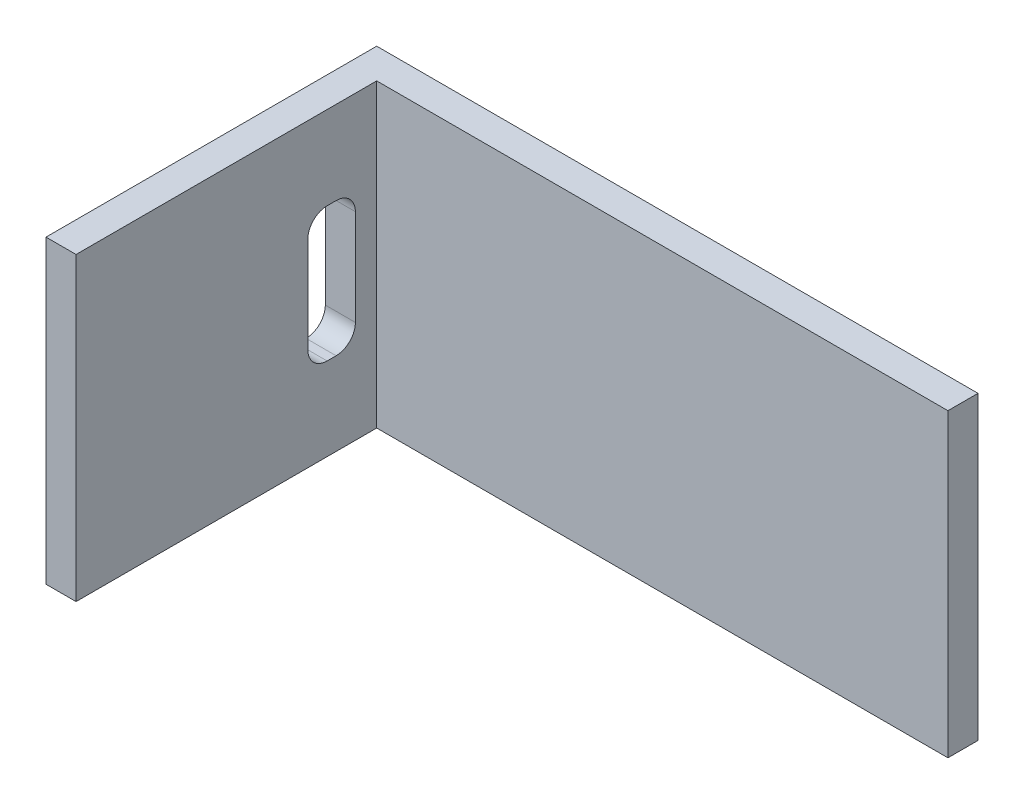
ISO-10303-21;
HEADER;
FILE_DESCRIPTION(('STEP AP214'),'2;1');
FILE_NAME('part.step','',(''),(''),'','','');
FILE_SCHEMA(('AUTOMOTIVE_DESIGN { 1 0 10303 214 1 1 1 1 }'));
ENDSEC;
DATA;
#1=APPLICATION_CONTEXT('core data for automotive mechanical design processes');
#2=APPLICATION_PROTOCOL_DEFINITION('international standard','automotive_design',2000,#1);
#3=PRODUCT_CONTEXT('',#1,'mechanical');
#4=PRODUCT('Part','Part','',(#3));
#5=PRODUCT_RELATED_PRODUCT_CATEGORY('part','',(#4));
#6=PRODUCT_DEFINITION_FORMATION('','',#4);
#7=PRODUCT_DEFINITION_CONTEXT('part definition',#1,'design');
#8=PRODUCT_DEFINITION('design','',#6,#7);
#9=PRODUCT_DEFINITION_SHAPE('','',#8);
#10=(LENGTH_UNIT() NAMED_UNIT(*) SI_UNIT(.MILLI.,.METRE.));
#11=(NAMED_UNIT(*) PLANE_ANGLE_UNIT() SI_UNIT($,.RADIAN.));
#12=(NAMED_UNIT(*) SI_UNIT($,.STERADIAN.) SOLID_ANGLE_UNIT());
#13=UNCERTAINTY_MEASURE_WITH_UNIT(LENGTH_MEASURE(1.E-05),#10,'distance_accuracy_value','');
#14=(GEOMETRIC_REPRESENTATION_CONTEXT(3) GLOBAL_UNCERTAINTY_ASSIGNED_CONTEXT((#13)) GLOBAL_UNIT_ASSIGNED_CONTEXT((#10,
#11,#12)) REPRESENTATION_CONTEXT('',''));
#15=CARTESIAN_POINT('',(0.,0.,0.));
#16=DIRECTION('',(0.,0.,1.));
#17=DIRECTION('',(1.,0.,0.));
#18=AXIS2_PLACEMENT_3D('',#15,#16,#17);
#19=CARTESIAN_POINT('',(0.,0.,2.));
#20=DIRECTION('',(0.,0.,-1.));
#21=DIRECTION('',(-1.,0.,0.));
#22=AXIS2_PLACEMENT_3D('',#19,#20,#21);
#23=PLANE('',#22);
#24=DIRECTION('',(0.,1.,0.));
#25=VECTOR('',#24,1.);
#26=CARTESIAN_POINT('',(2.,20.,2.));
#27=LINE('',#26,#25);
#28=CARTESIAN_POINT('',(2.,0.,2.));
#29=VERTEX_POINT('',#28);
#30=CARTESIAN_POINT('',(2.,20.,2.));
#31=VERTEX_POINT('',#30);
#32=EDGE_CURVE('E210',#29,#31,#27,.T.);
#33=ORIENTED_EDGE('',*,*,#32,.F.);
#34=DIRECTION('',(1.,0.,0.));
#35=VECTOR('',#34,1.);
#36=CARTESIAN_POINT('',(0.,0.,2.));
#37=LINE('',#36,#35);
#38=CARTESIAN_POINT('',(40.,0.,2.));
#39=VERTEX_POINT('',#38);
#40=EDGE_CURVE('E230',#29,#39,#37,.T.);
#41=ORIENTED_EDGE('',*,*,#40,.T.);
#42=DIRECTION('',(0.,1.,0.));
#43=VECTOR('',#42,1.);
#44=CARTESIAN_POINT('',(40.,0.,2.));
#45=LINE('',#44,#43);
#46=CARTESIAN_POINT('',(40.,20.,2.));
#47=VERTEX_POINT('',#46);
#48=EDGE_CURVE('E232',#39,#47,#45,.T.);
#49=ORIENTED_EDGE('',*,*,#48,.T.);
#50=DIRECTION('',(-1.,0.,0.));
#51=VECTOR('',#50,1.);
#52=CARTESIAN_POINT('',(0.,20.,2.));
#53=LINE('',#52,#51);
#54=EDGE_CURVE('E235',#47,#31,#53,.T.);
#55=ORIENTED_EDGE('',*,*,#54,.T.);
#56=EDGE_LOOP('',(#33,#41,#49,#55));
#57=FACE_BOUND('',#56,.T.);
#58=ADVANCED_FACE('F39',(#57),#23,.F.);
#59=CARTESIAN_POINT('',(0.,0.,2.));
#60=DIRECTION('',(1.,0.,0.));
#61=DIRECTION('',(0.,0.,-1.));
#62=AXIS2_PLACEMENT_3D('',#59,#60,#61);
#63=PLANE('',#62);
#64=DIRECTION('',(0.,1.,0.));
#65=VECTOR('',#64,1.);
#66=CARTESIAN_POINT('',(0.,0.,3.41915275934141));
#67=LINE('',#66,#65);
#68=CARTESIAN_POINT('',(0.,6.79416524423338,3.41915275934141));
#69=VERTEX_POINT('',#68);
#70=CARTESIAN_POINT('',(0.,13.1741652442334,3.41915275934141));
#71=VERTEX_POINT('',#70);
#72=EDGE_CURVE('E204',#69,#71,#67,.T.);
#73=ORIENTED_EDGE('',*,*,#72,.T.);
#74=CARTESIAN_POINT('',(0.,13.1741652442334,4.69915275934145));
#75=DIRECTION('',(1.,0.,0.));
#76=DIRECTION('',(0.,0.,-1.));
#77=AXIS2_PLACEMENT_3D('',#74,#75,#76);
#78=CIRCLE('',#77,1.28000000000002);
#79=CARTESIAN_POINT('',(0.,14.4541652442334,4.69915275934145));
#80=VERTEX_POINT('',#79);
#81=EDGE_CURVE('E207',#71,#80,#78,.T.);
#82=ORIENTED_EDGE('',*,*,#81,.T.);
#83=DIRECTION('',(0.,0.,1.));
#84=VECTOR('',#83,1.);
#85=CARTESIAN_POINT('',(0.,14.4541652442334,2.));
#86=LINE('',#85,#84);
#87=CARTESIAN_POINT('',(0.,14.4541652442334,5.29915275934143));
#88=VERTEX_POINT('',#87);
#89=EDGE_CURVE('E179',#80,#88,#86,.T.);
#90=ORIENTED_EDGE('',*,*,#89,.T.);
#91=CARTESIAN_POINT('',(0.,13.1741652442334,5.29915275934147));
#92=DIRECTION('',(1.,0.,0.));
#93=DIRECTION('',(0.,0.,-1.));
#94=AXIS2_PLACEMENT_3D('',#91,#92,#93);
#95=CIRCLE('',#94,1.27999999999999);
#96=CARTESIAN_POINT('',(0.,13.1741652442334,6.57915275934146));
#97=VERTEX_POINT('',#96);
#98=EDGE_CURVE('E146',#88,#97,#95,.T.);
#99=ORIENTED_EDGE('',*,*,#98,.T.);
#100=DIRECTION('',(0.,-1.,0.));
#101=VECTOR('',#100,1.);
#102=CARTESIAN_POINT('',(0.,0.,6.57915275934146));
#103=LINE('',#102,#101);
#104=CARTESIAN_POINT('',(0.,6.79416524423337,6.57915275934144));
#105=VERTEX_POINT('',#104);
#106=EDGE_CURVE('E192',#97,#105,#103,.T.);
#107=ORIENTED_EDGE('',*,*,#106,.T.);
#108=CARTESIAN_POINT('',(0.,6.79416524423336,5.29915275934142));
#109=DIRECTION('',(1.,0.,0.));
#110=DIRECTION('',(0.,0.,-1.));
#111=AXIS2_PLACEMENT_3D('',#108,#109,#110);
#112=CIRCLE('',#111,1.28000000000001);
#113=CARTESIAN_POINT('',(0.,5.51416524423337,5.29915275934142));
#114=VERTEX_POINT('',#113);
#115=EDGE_CURVE('E195',#105,#114,#112,.T.);
#116=ORIENTED_EDGE('',*,*,#115,.T.);
#117=DIRECTION('',(0.,0.,-1.));
#118=VECTOR('',#117,1.);
#119=CARTESIAN_POINT('',(0.,5.51416524423337,2.));
#120=LINE('',#119,#118);
#121=CARTESIAN_POINT('',(0.,5.51416524423337,4.69915275934136));
#122=VERTEX_POINT('',#121);
#123=EDGE_CURVE('E198',#114,#122,#120,.T.);
#124=ORIENTED_EDGE('',*,*,#123,.T.);
#125=CARTESIAN_POINT('',(0.,6.79416524423338,4.69915275934141));
#126=DIRECTION('',(1.,0.,0.));
#127=DIRECTION('',(0.,0.,-1.));
#128=AXIS2_PLACEMENT_3D('',#125,#126,#127);
#129=CIRCLE('',#128,1.28);
#130=EDGE_CURVE('E201',#122,#69,#129,.T.);
#131=ORIENTED_EDGE('',*,*,#130,.T.);
#132=EDGE_LOOP('',(#73,#82,#90,#99,#107,#116,#124,#131));
#133=FACE_BOUND('',#132,.T.);
#134=DIRECTION('',(0.,-1.,0.));
#135=VECTOR('',#134,1.);
#136=CARTESIAN_POINT('',(0.,0.,0.));
#137=LINE('',#136,#135);
#138=CARTESIAN_POINT('',(0.,20.,0.));
#139=VERTEX_POINT('',#138);
#140=CARTESIAN_POINT('',(0.,0.,0.));
#141=VERTEX_POINT('',#140);
#142=EDGE_CURVE('E229',#139,#141,#137,.T.);
#143=ORIENTED_EDGE('',*,*,#142,.T.);
#144=DIRECTION('',(0.,0.,-1.));
#145=VECTOR('',#144,1.);
#146=CARTESIAN_POINT('',(0.,0.,2.));
#147=LINE('',#146,#145);
#148=CARTESIAN_POINT('',(0.,0.,22.));
#149=VERTEX_POINT('',#148);
#150=EDGE_CURVE('E11',#149,#141,#147,.T.);
#151=ORIENTED_EDGE('',*,*,#150,.F.);
#152=DIRECTION('',(0.,-1.,0.));
#153=VECTOR('',#152,1.);
#154=CARTESIAN_POINT('',(0.,20.,22.));
#155=LINE('',#154,#153);
#156=CARTESIAN_POINT('',(0.,20.,22.));
#157=VERTEX_POINT('',#156);
#158=EDGE_CURVE('E211',#157,#149,#155,.T.);
#159=ORIENTED_EDGE('',*,*,#158,.F.);
#160=DIRECTION('',(0.,0.,-1.));
#161=VECTOR('',#160,1.);
#162=CARTESIAN_POINT('',(0.,20.,2.));
#163=LINE('',#162,#161);
#164=EDGE_CURVE('E237',#157,#139,#163,.T.);
#165=ORIENTED_EDGE('',*,*,#164,.T.);
#166=EDGE_LOOP('',(#143,#151,#159,#165));
#167=FACE_BOUND('',#166,.T.);
#168=ADVANCED_FACE('F41',(#133,#167),#63,.F.);
#169=CARTESIAN_POINT('',(0.,0.,2.));
#170=DIRECTION('',(0.,1.,0.));
#171=DIRECTION('',(0.,0.,1.));
#172=AXIS2_PLACEMENT_3D('',#169,#170,#171);
#173=PLANE('',#172);
#174=DIRECTION('',(1.,0.,0.));
#175=VECTOR('',#174,1.);
#176=CARTESIAN_POINT('',(0.,0.,0.));
#177=LINE('',#176,#175);
#178=CARTESIAN_POINT('',(40.,0.,0.));
#179=VERTEX_POINT('',#178);
#180=EDGE_CURVE('E240',#141,#179,#177,.T.);
#181=ORIENTED_EDGE('',*,*,#180,.T.);
#182=DIRECTION('',(0.,0.,-1.));
#183=VECTOR('',#182,1.);
#184=CARTESIAN_POINT('',(40.,0.,2.));
#185=LINE('',#184,#183);
#186=EDGE_CURVE('E47',#39,#179,#185,.T.);
#187=ORIENTED_EDGE('',*,*,#186,.F.);
#188=ORIENTED_EDGE('',*,*,#40,.F.);
#189=DIRECTION('',(0.,0.,-1.));
#190=VECTOR('',#189,1.);
#191=CARTESIAN_POINT('',(2.,0.,22.));
#192=LINE('',#191,#190);
#193=CARTESIAN_POINT('',(2.,0.,22.));
#194=VERTEX_POINT('',#193);
#195=EDGE_CURVE('E226',#194,#29,#192,.T.);
#196=ORIENTED_EDGE('',*,*,#195,.F.);
#197=DIRECTION('',(1.,0.,0.));
#198=VECTOR('',#197,1.);
#199=CARTESIAN_POINT('',(0.,0.,22.));
#200=LINE('',#199,#198);
#201=EDGE_CURVE('E214',#149,#194,#200,.T.);
#202=ORIENTED_EDGE('',*,*,#201,.F.);
#203=ORIENTED_EDGE('',*,*,#150,.T.);
#204=EDGE_LOOP('',(#181,#187,#188,#196,#202,#203));
#205=FACE_BOUND('',#204,.T.);
#206=ADVANCED_FACE('F275',(#205),#173,.F.);
#207=CARTESIAN_POINT('',(40.,0.,2.));
#208=DIRECTION('',(-1.,0.,0.));
#209=DIRECTION('',(0.,0.,1.));
#210=AXIS2_PLACEMENT_3D('',#207,#208,#209);
#211=PLANE('',#210);
#212=DIRECTION('',(0.,1.,0.));
#213=VECTOR('',#212,1.);
#214=CARTESIAN_POINT('',(40.,0.,0.));
#215=LINE('',#214,#213);
#216=CARTESIAN_POINT('',(40.,20.,0.));
#217=VERTEX_POINT('',#216);
#218=EDGE_CURVE('E242',#179,#217,#215,.T.);
#219=ORIENTED_EDGE('',*,*,#218,.T.);
#220=DIRECTION('',(0.,0.,-1.));
#221=VECTOR('',#220,1.);
#222=CARTESIAN_POINT('',(40.,20.,2.));
#223=LINE('',#222,#221);
#224=EDGE_CURVE('E247',#47,#217,#223,.T.);
#225=ORIENTED_EDGE('',*,*,#224,.F.);
#226=ORIENTED_EDGE('',*,*,#48,.F.);
#227=ORIENTED_EDGE('',*,*,#186,.T.);
#228=EDGE_LOOP('',(#219,#225,#226,#227));
#229=FACE_BOUND('',#228,.T.);
#230=ADVANCED_FACE('F254',(#229),#211,.F.);
#231=CARTESIAN_POINT('',(0.,20.,2.));
#232=DIRECTION('',(0.,-1.,0.));
#233=DIRECTION('',(0.,0.,-1.));
#234=AXIS2_PLACEMENT_3D('',#231,#232,#233);
#235=PLANE('',#234);
#236=DIRECTION('',(-1.,0.,0.));
#237=VECTOR('',#236,1.);
#238=CARTESIAN_POINT('',(0.,20.,0.));
#239=LINE('',#238,#237);
#240=EDGE_CURVE('E233',#217,#139,#239,.T.);
#241=ORIENTED_EDGE('',*,*,#240,.T.);
#242=ORIENTED_EDGE('',*,*,#164,.F.);
#243=DIRECTION('',(-1.,0.,0.));
#244=VECTOR('',#243,1.);
#245=CARTESIAN_POINT('',(0.,20.,22.));
#246=LINE('',#245,#244);
#247=CARTESIAN_POINT('',(2.,20.,22.));
#248=VERTEX_POINT('',#247);
#249=EDGE_CURVE('E218',#248,#157,#246,.T.);
#250=ORIENTED_EDGE('',*,*,#249,.F.);
#251=DIRECTION('',(0.,0.,-1.));
#252=VECTOR('',#251,1.);
#253=CARTESIAN_POINT('',(2.,20.,22.));
#254=LINE('',#253,#252);
#255=EDGE_CURVE('E221',#248,#31,#254,.T.);
#256=ORIENTED_EDGE('',*,*,#255,.T.);
#257=ORIENTED_EDGE('',*,*,#54,.F.);
#258=ORIENTED_EDGE('',*,*,#224,.T.);
#259=EDGE_LOOP('',(#241,#242,#250,#256,#257,#258));
#260=FACE_BOUND('',#259,.T.);
#261=ADVANCED_FACE('F263',(#260),#235,.F.);
#262=CARTESIAN_POINT('',(0.,0.,0.));
#263=DIRECTION('',(0.,0.,-1.));
#264=DIRECTION('',(-1.,0.,0.));
#265=AXIS2_PLACEMENT_3D('',#262,#263,#264);
#266=PLANE('',#265);
#267=ORIENTED_EDGE('',*,*,#142,.F.);
#268=ORIENTED_EDGE('',*,*,#240,.F.);
#269=ORIENTED_EDGE('',*,*,#218,.F.);
#270=ORIENTED_EDGE('',*,*,#180,.F.);
#271=EDGE_LOOP('',(#267,#268,#269,#270));
#272=FACE_BOUND('',#271,.T.);
#273=ADVANCED_FACE('F261',(#272),#266,.T.);
#274=CARTESIAN_POINT('',(2.,20.,22.));
#275=DIRECTION('',(-1.,0.,0.));
#276=DIRECTION('',(0.,-1.,0.));
#277=AXIS2_PLACEMENT_3D('',#274,#275,#276);
#278=PLANE('',#277);
#279=DIRECTION('',(0.,0.,1.));
#280=VECTOR('',#279,1.);
#281=CARTESIAN_POINT('',(2.,14.4541652442334,4.69915275934145));
#282=LINE('',#281,#280);
#283=CARTESIAN_POINT('',(2.,14.4541652442334,4.69915275934145));
#284=VERTEX_POINT('',#283);
#285=CARTESIAN_POINT('',(2.,14.4541652442334,5.29915275934143));
#286=VERTEX_POINT('',#285);
#287=EDGE_CURVE('E152',#284,#286,#282,.T.);
#288=ORIENTED_EDGE('',*,*,#287,.F.);
#289=CARTESIAN_POINT('',(2.,13.1741652442334,4.69915275934145));
#290=DIRECTION('',(1.,0.,0.));
#291=DIRECTION('',(0.,1.,0.));
#292=AXIS2_PLACEMENT_3D('',#289,#290,#291);
#293=CIRCLE('',#292,1.28000000000002);
#294=CARTESIAN_POINT('',(2.,13.1741652442334,3.41915275934141));
#295=VERTEX_POINT('',#294);
#296=EDGE_CURVE('E62',#295,#284,#293,.T.);
#297=ORIENTED_EDGE('',*,*,#296,.F.);
#298=DIRECTION('',(0.,1.,0.));
#299=VECTOR('',#298,1.);
#300=CARTESIAN_POINT('',(2.,6.79416524423338,3.41915275934141));
#301=LINE('',#300,#299);
#302=CARTESIAN_POINT('',(2.,6.79416524423338,3.41915275934141));
#303=VERTEX_POINT('',#302);
#304=EDGE_CURVE('E174',#303,#295,#301,.T.);
#305=ORIENTED_EDGE('',*,*,#304,.F.);
#306=CARTESIAN_POINT('',(2.,6.79416524423338,4.69915275934141));
#307=DIRECTION('',(1.,0.,0.));
#308=DIRECTION('',(0.,1.,0.));
#309=AXIS2_PLACEMENT_3D('',#306,#307,#308);
#310=CIRCLE('',#309,1.28);
#311=CARTESIAN_POINT('',(2.,5.51416524423337,4.69915275934136));
#312=VERTEX_POINT('',#311);
#313=EDGE_CURVE('E171',#312,#303,#310,.T.);
#314=ORIENTED_EDGE('',*,*,#313,.F.);
#315=DIRECTION('',(0.,0.,-1.));
#316=VECTOR('',#315,1.);
#317=CARTESIAN_POINT('',(2.,5.51416524423337,5.29915275934142));
#318=LINE('',#317,#316);
#319=CARTESIAN_POINT('',(2.,5.51416524423337,5.29915275934142));
#320=VERTEX_POINT('',#319);
#321=EDGE_CURVE('E168',#320,#312,#318,.T.);
#322=ORIENTED_EDGE('',*,*,#321,.F.);
#323=CARTESIAN_POINT('',(2.,6.79416524423336,5.29915275934142));
#324=DIRECTION('',(1.,0.,0.));
#325=DIRECTION('',(0.,1.,0.));
#326=AXIS2_PLACEMENT_3D('',#323,#324,#325);
#327=CIRCLE('',#326,1.28000000000001);
#328=CARTESIAN_POINT('',(2.,6.79416524423337,6.57915275934144));
#329=VERTEX_POINT('',#328);
#330=EDGE_CURVE('E162',#329,#320,#327,.T.);
#331=ORIENTED_EDGE('',*,*,#330,.F.);
#332=DIRECTION('',(0.,-1.,0.));
#333=VECTOR('',#332,1.);
#334=CARTESIAN_POINT('',(2.,13.1741652442334,6.57915275934146));
#335=LINE('',#334,#333);
#336=CARTESIAN_POINT('',(2.,13.1741652442334,6.57915275934146));
#337=VERTEX_POINT('',#336);
#338=EDGE_CURVE('E160',#337,#329,#335,.T.);
#339=ORIENTED_EDGE('',*,*,#338,.F.);
#340=CARTESIAN_POINT('',(2.,13.1741652442334,5.29915275934147));
#341=DIRECTION('',(1.,0.,0.));
#342=DIRECTION('',(0.,1.,0.));
#343=AXIS2_PLACEMENT_3D('',#340,#341,#342);
#344=CIRCLE('',#343,1.27999999999999);
#345=EDGE_CURVE('E143',#286,#337,#344,.T.);
#346=ORIENTED_EDGE('',*,*,#345,.F.);
#347=EDGE_LOOP('',(#288,#297,#305,#314,#322,#331,#339,#346));
#348=FACE_BOUND('',#347,.T.);
#349=ORIENTED_EDGE('',*,*,#32,.T.);
#350=ORIENTED_EDGE('',*,*,#255,.F.);
#351=DIRECTION('',(0.,1.,0.));
#352=VECTOR('',#351,1.);
#353=CARTESIAN_POINT('',(2.,20.,22.));
#354=LINE('',#353,#352);
#355=EDGE_CURVE('E216',#194,#248,#354,.T.);
#356=ORIENTED_EDGE('',*,*,#355,.F.);
#357=ORIENTED_EDGE('',*,*,#195,.T.);
#358=EDGE_LOOP('',(#349,#350,#356,#357));
#359=FACE_BOUND('',#358,.T.);
#360=ADVANCED_FACE('F156',(#348,#359),#278,.F.);
#361=CARTESIAN_POINT('',(0.,0.,22.));
#362=DIRECTION('',(0.,0.,1.));
#363=DIRECTION('',(1.,0.,0.));
#364=AXIS2_PLACEMENT_3D('',#361,#362,#363);
#365=PLANE('',#364);
#366=ORIENTED_EDGE('',*,*,#158,.T.);
#367=ORIENTED_EDGE('',*,*,#201,.T.);
#368=ORIENTED_EDGE('',*,*,#355,.T.);
#369=ORIENTED_EDGE('',*,*,#249,.T.);
#370=EDGE_LOOP('',(#366,#367,#368,#369));
#371=FACE_BOUND('',#370,.T.);
#372=ADVANCED_FACE('F270',(#371),#365,.T.);
#373=CARTESIAN_POINT('',(-18.,13.1741652442334,4.69915275934145));
#374=DIRECTION('',(1.,0.,0.));
#375=DIRECTION('',(0.,1.,0.));
#376=AXIS2_PLACEMENT_3D('',#373,#374,#375);
#377=CYLINDRICAL_SURFACE('',#376,1.28000000000002);
#378=DIRECTION('',(1.,0.,0.));
#379=VECTOR('',#378,1.);
#380=CARTESIAN_POINT('',(-18.,13.1741652442334,3.41915275934141));
#381=LINE('',#380,#379);
#382=EDGE_CURVE('E177',#71,#295,#381,.T.);
#383=ORIENTED_EDGE('',*,*,#382,.T.);
#384=ORIENTED_EDGE('',*,*,#296,.T.);
#385=DIRECTION('',(1.,0.,0.));
#386=VECTOR('',#385,1.);
#387=CARTESIAN_POINT('',(-18.,14.4541652442334,4.69915275934145));
#388=LINE('',#387,#386);
#389=EDGE_CURVE('E149',#80,#284,#388,.T.);
#390=ORIENTED_EDGE('',*,*,#389,.F.);
#391=ORIENTED_EDGE('',*,*,#81,.F.);
#392=EDGE_LOOP('',(#383,#384,#390,#391));
#393=FACE_BOUND('',#392,.T.);
#394=ADVANCED_FACE('F302',(#393),#377,.F.);
#395=CARTESIAN_POINT('',(-18.,6.79416524423337,3.41915275934141));
#396=DIRECTION('',(0.,0.,-1.));
#397=DIRECTION('',(-1.,0.,0.));
#398=AXIS2_PLACEMENT_3D('',#395,#396,#397);
#399=PLANE('',#398);
#400=DIRECTION('',(1.,0.,0.));
#401=VECTOR('',#400,1.);
#402=CARTESIAN_POINT('',(-18.,6.79416524423337,3.41915275934141));
#403=LINE('',#402,#401);
#404=EDGE_CURVE('E180',#69,#303,#403,.T.);
#405=ORIENTED_EDGE('',*,*,#404,.T.);
#406=ORIENTED_EDGE('',*,*,#304,.T.);
#407=ORIENTED_EDGE('',*,*,#382,.F.);
#408=ORIENTED_EDGE('',*,*,#72,.F.);
#409=EDGE_LOOP('',(#405,#406,#407,#408));
#410=FACE_BOUND('',#409,.T.);
#411=ADVANCED_FACE('F321',(#410),#399,.F.);
#412=CARTESIAN_POINT('',(-18.,6.79416524423337,4.69915275934141));
#413=DIRECTION('',(1.,0.,0.));
#414=DIRECTION('',(0.,1.,0.));
#415=AXIS2_PLACEMENT_3D('',#412,#413,#414);
#416=CYLINDRICAL_SURFACE('',#415,1.28);
#417=DIRECTION('',(1.,0.,0.));
#418=VECTOR('',#417,1.);
#419=CARTESIAN_POINT('',(-18.,5.51416524423337,4.69915275934136));
#420=LINE('',#419,#418);
#421=EDGE_CURVE('E182',#122,#312,#420,.T.);
#422=ORIENTED_EDGE('',*,*,#421,.T.);
#423=ORIENTED_EDGE('',*,*,#313,.T.);
#424=ORIENTED_EDGE('',*,*,#404,.F.);
#425=ORIENTED_EDGE('',*,*,#130,.F.);
#426=EDGE_LOOP('',(#422,#423,#424,#425));
#427=FACE_BOUND('',#426,.T.);
#428=ADVANCED_FACE('F329',(#427),#416,.F.);
#429=CARTESIAN_POINT('',(-18.,5.51416524423337,5.29915275934142));
#430=DIRECTION('',(0.,-1.,0.));
#431=DIRECTION('',(1.,0.,0.));
#432=AXIS2_PLACEMENT_3D('',#429,#430,#431);
#433=PLANE('',#432);
#434=DIRECTION('',(1.,0.,0.));
#435=VECTOR('',#434,1.);
#436=CARTESIAN_POINT('',(-18.,5.51416524423337,5.29915275934142));
#437=LINE('',#436,#435);
#438=EDGE_CURVE('E184',#114,#320,#437,.T.);
#439=ORIENTED_EDGE('',*,*,#438,.T.);
#440=ORIENTED_EDGE('',*,*,#321,.T.);
#441=ORIENTED_EDGE('',*,*,#421,.F.);
#442=ORIENTED_EDGE('',*,*,#123,.F.);
#443=EDGE_LOOP('',(#439,#440,#441,#442));
#444=FACE_BOUND('',#443,.T.);
#445=ADVANCED_FACE('F338',(#444),#433,.F.);
#446=CARTESIAN_POINT('',(-18.,6.79416524423336,5.29915275934142));
#447=DIRECTION('',(1.,0.,0.));
#448=DIRECTION('',(0.,1.,0.));
#449=AXIS2_PLACEMENT_3D('',#446,#447,#448);
#450=CYLINDRICAL_SURFACE('',#449,1.28000000000001);
#451=DIRECTION('',(1.,0.,0.));
#452=VECTOR('',#451,1.);
#453=CARTESIAN_POINT('',(-18.,6.79416524423336,6.57915275934144));
#454=LINE('',#453,#452);
#455=EDGE_CURVE('E186',#105,#329,#454,.T.);
#456=ORIENTED_EDGE('',*,*,#455,.T.);
#457=ORIENTED_EDGE('',*,*,#330,.T.);
#458=ORIENTED_EDGE('',*,*,#438,.F.);
#459=ORIENTED_EDGE('',*,*,#115,.F.);
#460=EDGE_LOOP('',(#456,#457,#458,#459));
#461=FACE_BOUND('',#460,.T.);
#462=ADVANCED_FACE('F347',(#461),#450,.F.);
#463=CARTESIAN_POINT('',(-18.,13.1741652442334,6.57915275934146));
#464=DIRECTION('',(0.,0.,1.));
#465=DIRECTION('',(1.,0.,0.));
#466=AXIS2_PLACEMENT_3D('',#463,#464,#465);
#467=PLANE('',#466);
#468=DIRECTION('',(1.,0.,0.));
#469=VECTOR('',#468,1.);
#470=CARTESIAN_POINT('',(-18.,13.1741652442334,6.57915275934146));
#471=LINE('',#470,#469);
#472=EDGE_CURVE('E148',#97,#337,#471,.T.);
#473=ORIENTED_EDGE('',*,*,#472,.T.);
#474=ORIENTED_EDGE('',*,*,#338,.T.);
#475=ORIENTED_EDGE('',*,*,#455,.F.);
#476=ORIENTED_EDGE('',*,*,#106,.F.);
#477=EDGE_LOOP('',(#473,#474,#475,#476));
#478=FACE_BOUND('',#477,.T.);
#479=ADVANCED_FACE('F356',(#478),#467,.F.);
#480=CARTESIAN_POINT('',(-18.,13.1741652442334,5.29915275934147));
#481=DIRECTION('',(1.,0.,0.));
#482=DIRECTION('',(0.,1.,0.));
#483=AXIS2_PLACEMENT_3D('',#480,#481,#482);
#484=CYLINDRICAL_SURFACE('',#483,1.27999999999999);
#485=DIRECTION('',(1.,0.,0.));
#486=VECTOR('',#485,1.);
#487=CARTESIAN_POINT('',(-18.,14.4541652442334,5.29915275934143));
#488=LINE('',#487,#486);
#489=EDGE_CURVE('E54',#88,#286,#488,.T.);
#490=ORIENTED_EDGE('',*,*,#489,.T.);
#491=ORIENTED_EDGE('',*,*,#345,.T.);
#492=ORIENTED_EDGE('',*,*,#472,.F.);
#493=ORIENTED_EDGE('',*,*,#98,.F.);
#494=EDGE_LOOP('',(#490,#491,#492,#493));
#495=FACE_BOUND('',#494,.T.);
#496=ADVANCED_FACE('F140',(#495),#484,.F.);
#497=CARTESIAN_POINT('',(-18.,14.4541652442334,4.69915275934145));
#498=DIRECTION('',(0.,1.,0.));
#499=DIRECTION('',(-1.,0.,0.));
#500=AXIS2_PLACEMENT_3D('',#497,#498,#499);
#501=PLANE('',#500);
#502=ORIENTED_EDGE('',*,*,#389,.T.);
#503=ORIENTED_EDGE('',*,*,#287,.T.);
#504=ORIENTED_EDGE('',*,*,#489,.F.);
#505=ORIENTED_EDGE('',*,*,#89,.F.);
#506=EDGE_LOOP('',(#502,#503,#504,#505));
#507=FACE_BOUND('',#506,.T.);
#508=ADVANCED_FACE('F153',(#507),#501,.F.);
#509=CLOSED_SHELL('',(#58,#168,#206,#230,#261,#273,#360,#372,#394,#411,#428,#445,#462,#479,#496,#508));
#510=MANIFOLD_SOLID_BREP('B2',#509);
#511=ADVANCED_BREP_SHAPE_REPRESENTATION('',(#18,#510),#14);
#512=SHAPE_DEFINITION_REPRESENTATION(#9,#511);
ENDSEC;
END-ISO-10303-21;
